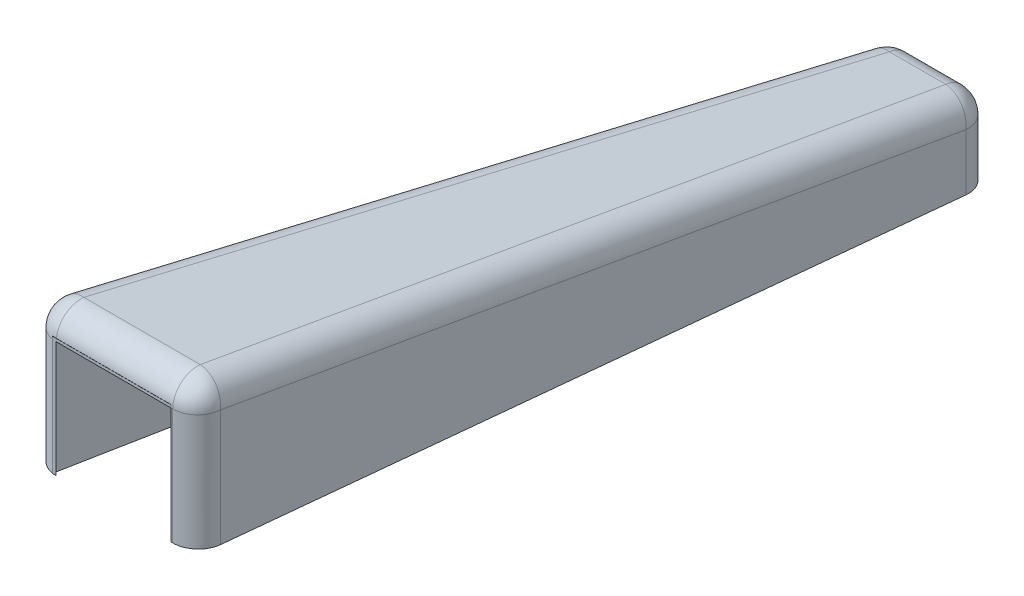
ISO-10303-21;
HEADER;
FILE_DESCRIPTION(('STEP AP214'),'2;1');
FILE_NAME('part.step','',(''),(''),'','','');
FILE_SCHEMA(('AUTOMOTIVE_DESIGN { 1 0 10303 214 1 1 1 1 }'));
ENDSEC;
DATA;
#1=APPLICATION_CONTEXT('core data for automotive mechanical design processes');
#2=APPLICATION_PROTOCOL_DEFINITION('international standard','automotive_design',2000,#1);
#3=PRODUCT_CONTEXT('',#1,'mechanical');
#4=PRODUCT('Part','Part','',(#3));
#5=PRODUCT_RELATED_PRODUCT_CATEGORY('part','',(#4));
#6=PRODUCT_DEFINITION_FORMATION('','',#4);
#7=PRODUCT_DEFINITION_CONTEXT('part definition',#1,'design');
#8=PRODUCT_DEFINITION('design','',#6,#7);
#9=PRODUCT_DEFINITION_SHAPE('','',#8);
#10=(LENGTH_UNIT() NAMED_UNIT(*) SI_UNIT(.MILLI.,.METRE.));
#11=(NAMED_UNIT(*) PLANE_ANGLE_UNIT() SI_UNIT($,.RADIAN.));
#12=(NAMED_UNIT(*) SI_UNIT($,.STERADIAN.) SOLID_ANGLE_UNIT());
#13=UNCERTAINTY_MEASURE_WITH_UNIT(LENGTH_MEASURE(1.E-05),#10,'distance_accuracy_value','');
#14=(GEOMETRIC_REPRESENTATION_CONTEXT(3) GLOBAL_UNCERTAINTY_ASSIGNED_CONTEXT((#13)) GLOBAL_UNIT_ASSIGNED_CONTEXT((#10,
#11,#12)) REPRESENTATION_CONTEXT('',''));
#15=CARTESIAN_POINT('',(0.,0.,0.));
#16=DIRECTION('',(0.,0.,1.));
#17=DIRECTION('',(1.,0.,0.));
#18=AXIS2_PLACEMENT_3D('',#15,#16,#17);
#19=CARTESIAN_POINT('',(0.,0.,300.));
#20=DIRECTION('',(0.,0.,1.));
#21=DIRECTION('',(1.,0.,0.));
#22=AXIS2_PLACEMENT_3D('',#19,#20,#21);
#23=PLANE('',#22);
#24=DIRECTION('',(-1.,0.,0.));
#25=VECTOR('',#24,1.);
#26=CARTESIAN_POINT('',(-48.093004145453,54.8807064057236,300.));
#27=LINE('',#26,#25);
#28=CARTESIAN_POINT('',(10.6163492796095,54.8807064057236,300.));
#29=VERTEX_POINT('',#28);
#30=CARTESIAN_POINT('',(9.87991580809443,54.8807064057235,300.));
#31=VERTEX_POINT('',#30);
#32=EDGE_CURVE('E283',#29,#31,#27,.T.);
#33=ORIENTED_EDGE('',*,*,#32,.T.);
#34=DIRECTION('',(0.,-1.,0.));
#35=VECTOR('',#34,1.);
#36=CARTESIAN_POINT('',(9.87991580809444,0.,300.));
#37=LINE('',#36,#35);
#38=CARTESIAN_POINT('',(9.87991580809443,8.08106382938917,300.));
#39=VERTEX_POINT('',#38);
#40=EDGE_CURVE('E12',#31,#39,#37,.T.);
#41=ORIENTED_EDGE('',*,*,#40,.T.);
#42=DIRECTION('',(1.,0.,0.));
#43=VECTOR('',#42,1.);
#44=CARTESIAN_POINT('',(-48.093004145453,8.08106382938917,300.));
#45=LINE('',#44,#43);
#46=CARTESIAN_POINT('',(10.6163492796095,8.08106382938917,300.));
#47=VERTEX_POINT('',#46);
#48=EDGE_CURVE('E61',#39,#47,#45,.T.);
#49=ORIENTED_EDGE('',*,*,#48,.T.);
#50=DIRECTION('',(0.,1.,0.));
#51=VECTOR('',#50,1.);
#52=CARTESIAN_POINT('',(10.6163492796095,66.0810638293891,300.));
#53=LINE('',#52,#51);
#54=EDGE_CURVE('E290',#47,#29,#53,.T.);
#55=ORIENTED_EDGE('',*,*,#54,.T.);
#56=EDGE_LOOP('',(#33,#41,#49,#55));
#57=FACE_BOUND('',#56,.T.);
#58=ADVANCED_FACE('F57',(#57),#23,.T.);
#59=CARTESIAN_POINT('',(0.,0.,0.));
#60=DIRECTION('',(0.,0.,-1.));
#61=DIRECTION('',(-1.,0.,0.));
#62=AXIS2_PLACEMENT_3D('',#59,#60,#61);
#63=PLANE('',#62);
#64=DIRECTION('',(0.,1.,0.));
#65=VECTOR('',#64,1.);
#66=CARTESIAN_POINT('',(31.2364864820323,0.,0.));
#67=LINE('',#66,#65);
#68=CARTESIAN_POINT('',(31.2364864820323,23.0717134982937,0.));
#69=VERTEX_POINT('',#68);
#70=CARTESIAN_POINT('',(31.2364864820323,21.935678037314,0.));
#71=VERTEX_POINT('',#70);
#72=EDGE_CURVE('E196',#69,#71,#67,.F.);
#73=ORIENTED_EDGE('',*,*,#72,.T.);
#74=DIRECTION('',(-1.,0.,0.));
#75=VECTOR('',#74,1.);
#76=CARTESIAN_POINT('',(0.,21.935678037314,0.));
#77=LINE('',#76,#75);
#78=CARTESIAN_POINT('',(10.1276813759635,21.935678037314,0.));
#79=VERTEX_POINT('',#78);
#80=EDGE_CURVE('E68',#71,#79,#77,.T.);
#81=ORIENTED_EDGE('',*,*,#80,.T.);
#82=DIRECTION('',(0.,-1.,0.));
#83=VECTOR('',#82,1.);
#84=CARTESIAN_POINT('',(10.1276813759635,0.,0.));
#85=LINE('',#84,#83);
#86=CARTESIAN_POINT('',(10.1276813759635,0.,0.));
#87=VERTEX_POINT('',#86);
#88=EDGE_CURVE('E170',#79,#87,#85,.T.);
#89=ORIENTED_EDGE('',*,*,#88,.T.);
#90=DIRECTION('',(1.,0.,0.));
#91=VECTOR('',#90,1.);
#92=CARTESIAN_POINT('',(0.,0.,0.));
#93=LINE('',#92,#91);
#94=CARTESIAN_POINT('',(8.52458123778177,0.,0.));
#95=VERTEX_POINT('',#94);
#96=EDGE_CURVE('E259',#95,#87,#93,.T.);
#97=ORIENTED_EDGE('',*,*,#96,.F.);
#98=DIRECTION('',(0.,-1.,0.));
#99=VECTOR('',#98,1.);
#100=CARTESIAN_POINT('',(8.52458123778176,32.,0.));
#101=LINE('',#100,#99);
#102=CARTESIAN_POINT('',(8.52458123778176,23.0717134982937,0.));
#103=VERTEX_POINT('',#102);
#104=EDGE_CURVE('E431',#95,#103,#101,.F.);
#105=ORIENTED_EDGE('',*,*,#104,.T.);
#106=DIRECTION('',(-1.,0.,0.));
#107=VECTOR('',#106,1.);
#108=CARTESIAN_POINT('',(42.,23.0717134982937,0.));
#109=LINE('',#108,#107);
#110=EDGE_CURVE('E394',#103,#69,#109,.F.);
#111=ORIENTED_EDGE('',*,*,#110,.T.);
#112=EDGE_LOOP('',(#73,#81,#89,#97,#105,#111));
#113=FACE_BOUND('',#112,.T.);
#114=ADVANCED_FACE('F194',(#113),#63,.T.);
#115=CARTESIAN_POINT('',(0.,0.,0.));
#116=DIRECTION('',(0.,0.999637399577244,-0.0269271121074277));
#117=DIRECTION('',(0.,0.0269271121074277,0.999637399577244));
#118=AXIS2_PLACEMENT_3D('',#115,#116,#117);
#119=PLANE('',#118);
#120=DIRECTION('',(-0.0734179717950565,0.0268544428088677,0.99693963724938));
#121=VECTOR('',#120,1.);
#122=CARTESIAN_POINT('',(31.8005795657354,0.063037768205778,2.34020307981689));
#123=LINE('',#122,#121);
#124=CARTESIAN_POINT('',(31.9719255138638,0.000363740960931889,0.0135034558052503));
#125=VERTEX_POINT('',#124);
#126=EDGE_CURVE('E619',#125,#39,#123,.T.);
#127=ORIENTED_EDGE('',*,*,#126,.F.);
#128=CARTESIAN_POINT('',(31.2364864820323,0.269368794312972,10.));
#129=DIRECTION('',(0.,0.999637399577244,-0.0269271121074277));
#130=DIRECTION('',(0.,-0.0269271121074277,-0.999637399577244));
#131=AXIS2_PLACEMENT_3D('',#128,#129,#130);
#132=ELLIPSE('',#131,10.0036273194951,10.);
#133=CARTESIAN_POINT('',(41.2094795704218,0.289152439740628,10.7344445921479));
#134=VERTEX_POINT('',#133);
#135=EDGE_CURVE('E260',#125,#134,#132,.F.);
#136=ORIENTED_EDGE('',*,*,#135,.T.);
#137=DIRECTION('',(-0.0734179717950565,0.0268544428088677,0.99693963724938));
#138=VECTOR('',#137,1.);
#139=CARTESIAN_POINT('',(42.,0.,0.));
#140=LINE('',#139,#138);
#141=CARTESIAN_POINT('',(20.589342367999,7.83147868050385,290.734444592148));
#142=VERTEX_POINT('',#141);
#143=EDGE_CURVE('E345',#134,#142,#140,.T.);
#144=ORIENTED_EDGE('',*,*,#143,.T.);
#145=CARTESIAN_POINT('',(10.6163492796095,7.81169503507619,290.));
#146=DIRECTION('',(0.,0.999637399577244,-0.0269271121074277));
#147=DIRECTION('',(0.,-0.0269271121074277,-0.999637399577244));
#148=AXIS2_PLACEMENT_3D('',#145,#146,#147);
#149=ELLIPSE('',#148,10.0036273194951,10.);
#150=EDGE_CURVE('E448',#142,#47,#149,.F.);
#151=ORIENTED_EDGE('',*,*,#150,.T.);
#152=ORIENTED_EDGE('',*,*,#48,.F.);
#153=EDGE_LOOP('',(#127,#136,#144,#151,#152));
#154=FACE_BOUND('',#153,.T.);
#155=ADVANCED_FACE('F334',(#154),#119,.F.);
#156=CARTESIAN_POINT('',(0.,0.,0.));
#157=DIRECTION('',(0.987392832453581,0.,0.158288958614602));
#158=DIRECTION('',(0.158288958614602,0.,-0.987392832453581));
#159=AXIS2_PLACEMENT_3D('',#156,#157,#158);
#160=PLANE('',#159);
#161=DIRECTION('',(-0.157302430565157,0.111472224949708,0.981238955812016));
#162=VECTOR('',#161,1.);
#163=CARTESIAN_POINT('',(0.387792016125398,21.8406914463814,-2.41901305407675));
#164=LINE('',#163,#162);
#165=CARTESIAN_POINT('',(-46.2361509558435,54.8807064057236,288.417110413854));
#166=VERTEX_POINT('',#165);
#167=CARTESIAN_POINT('',(-1.34934708675405,23.0717134982937,8.41711041385398));
#168=VERTEX_POINT('',#167);
#169=EDGE_CURVE('E272',#166,#168,#164,.F.);
#170=ORIENTED_EDGE('',*,*,#169,.T.);
#171=DIRECTION('',(0.,-1.,0.));
#172=VECTOR('',#171,1.);
#173=CARTESIAN_POINT('',(-1.34934708675404,0.,8.41711041385398));
#174=LINE('',#173,#172);
#175=CARTESIAN_POINT('',(-1.34934708675405,0.226730688377901,8.41711041385398));
#176=VERTEX_POINT('',#175);
#177=EDGE_CURVE('E279',#168,#176,#174,.T.);
#178=ORIENTED_EDGE('',*,*,#177,.T.);
#179=DIRECTION('',(-0.158233000279283,0.0265878790043007,0.987043769198038));
#180=VECTOR('',#179,1.);
#181=CARTESIAN_POINT('',(0.,0.,0.));
#182=LINE('',#181,#180);
#183=CARTESIAN_POINT('',(-46.2361509558435,7.76905692914113,288.417110413854));
#184=VERTEX_POINT('',#183);
#185=EDGE_CURVE('E355',#176,#184,#182,.T.);
#186=ORIENTED_EDGE('',*,*,#185,.T.);
#187=DIRECTION('',(0.,-1.,0.));
#188=VECTOR('',#187,1.);
#189=CARTESIAN_POINT('',(-46.2361509558435,66.0810638293892,288.417110413854));
#190=LINE('',#189,#188);
#191=EDGE_CURVE('E276',#184,#166,#190,.F.);
#192=ORIENTED_EDGE('',*,*,#191,.T.);
#193=EDGE_LOOP('',(#170,#178,#186,#192));
#194=FACE_BOUND('',#193,.T.);
#195=ADVANCED_FACE('F407',(#194),#160,.F.);
#196=CARTESIAN_POINT('',(0.,31.5922774694907,-3.58899474984495));
#197=DIRECTION('',(0.,-0.993608912460825,0.112877495890091));
#198=DIRECTION('',(0.,-0.112877495890091,-0.993608912460825));
#199=AXIS2_PLACEMENT_3D('',#196,#197,#198);
#200=PLANE('',#199);
#201=DIRECTION('',(-1.,0.,0.));
#202=VECTOR('',#201,1.);
#203=CARTESIAN_POINT('',(19.906995854547,64.8167955303318,288.871225041099));
#204=LINE('',#203,#202);
#205=CARTESIAN_POINT('',(-36.3622226313077,64.8167955303318,288.871225041099));
#206=VERTEX_POINT('',#205);
#207=CARTESIAN_POINT('',(10.6163492796095,64.8167955303318,288.871225041099));
#208=VERTEX_POINT('',#207);
#209=EDGE_CURVE('E300',#206,#208,#204,.F.);
#210=ORIENTED_EDGE('',*,*,#209,.T.);
#211=DIRECTION('',(-0.0729775770860391,0.112576517272566,0.990959535501541));
#212=VECTOR('',#211,1.);
#213=CARTESIAN_POINT('',(31.9828548294835,31.8564414443926,-1.26368023304115));
#214=LINE('',#213,#212);
#215=CARTESIAN_POINT('',(31.2364864820323,33.0078026229019,8.87122504109909));
#216=VERTEX_POINT('',#215);
#217=EDGE_CURVE('E84',#208,#216,#214,.F.);
#218=ORIENTED_EDGE('',*,*,#217,.T.);
#219=DIRECTION('',(-1.,0.,0.));
#220=VECTOR('',#219,1.);
#221=CARTESIAN_POINT('',(0.,33.0078026229019,8.87122504109909));
#222=LINE('',#221,#220);
#223=CARTESIAN_POINT('',(8.52458123778177,33.0078026229019,8.87122504109909));
#224=VERTEX_POINT('',#223);
#225=EDGE_CURVE('E200',#216,#224,#222,.T.);
#226=ORIENTED_EDGE('',*,*,#225,.T.);
#227=DIRECTION('',(-0.157302430565158,0.111472224949708,0.981238955812016));
#228=VECTOR('',#227,1.);
#229=CARTESIAN_POINT('',(10.2617203406612,31.7767805709896,-1.96489842683164));
#230=LINE('',#229,#228);
#231=EDGE_CURVE('E295',#224,#206,#230,.T.);
#232=ORIENTED_EDGE('',*,*,#231,.T.);
#233=EDGE_LOOP('',(#210,#218,#226,#232));
#234=FACE_BOUND('',#233,.T.);
#235=ADVANCED_FACE('F303',(#234),#200,.F.);
#236=ORIENTED_EDGE('',*,*,#96,.T.);
#237=DIRECTION('',(-0.158233000279283,0.0265878790043007,0.987043769198038));
#238=VECTOR('',#237,1.);
#239=CARTESIAN_POINT('',(9.87410770645281,0.0426079644051987,1.58177061726362));
#240=LINE('',#239,#238);
#241=CARTESIAN_POINT('',(-37.9451122174537,8.07766785186749,299.873928324536));
#242=VERTEX_POINT('',#241);
#243=EDGE_CURVE('E176',#87,#242,#240,.T.);
#244=ORIENTED_EDGE('',*,*,#243,.T.);
#245=CARTESIAN_POINT('',(-36.3622226313077,7.81169503507619,290.));
#246=DIRECTION('',(0.,0.999637399577244,-0.0269271121074277));
#247=DIRECTION('',(0.,0.0269271121074277,0.999637399577244));
#248=AXIS2_PLACEMENT_3D('',#245,#246,#247);
#249=ELLIPSE('',#248,10.0036273194951,10.);
#250=EDGE_CURVE('E473',#242,#184,#249,.F.);
#251=ORIENTED_EDGE('',*,*,#250,.T.);
#252=ORIENTED_EDGE('',*,*,#185,.F.);
#253=CARTESIAN_POINT('',(8.52458123778176,0.269368794312972,10.));
#254=DIRECTION('',(0.,0.999637399577244,-0.0269271121074277));
#255=DIRECTION('',(0.,0.0269271121074277,0.999637399577244));
#256=AXIS2_PLACEMENT_3D('',#253,#254,#255);
#257=ELLIPSE('',#256,10.0036273194951,10.);
#258=EDGE_CURVE('E265',#176,#95,#257,.F.);
#259=ORIENTED_EDGE('',*,*,#258,.T.);
#260=EDGE_LOOP('',(#236,#244,#251,#252,#259));
#261=FACE_BOUND('',#260,.T.);
#262=ADVANCED_FACE('F366',(#261),#119,.F.);
#263=CARTESIAN_POINT('',(41.7734482792472,0.,3.07633655334425));
#264=DIRECTION('',(-0.99729930883895,0.,-0.0734444592147877));
#265=DIRECTION('',(-0.0734444592147877,0.,0.99729930883895));
#266=AXIS2_PLACEMENT_3D('',#263,#264,#265);
#267=PLANE('',#266);
#268=ORIENTED_EDGE('',*,*,#143,.F.);
#269=DIRECTION('',(0.,1.,0.));
#270=VECTOR('',#269,1.);
#271=CARTESIAN_POINT('',(41.2094795704218,32.,10.7344445921479));
#272=LINE('',#271,#270);
#273=CARTESIAN_POINT('',(41.2094795704218,23.0717134982937,10.7344445921479));
#274=VERTEX_POINT('',#273);
#275=EDGE_CURVE('E391',#134,#274,#272,.T.);
#276=ORIENTED_EDGE('',*,*,#275,.T.);
#277=DIRECTION('',(-0.0729775770860391,0.112576517272566,0.990959535501542));
#278=VECTOR('',#277,1.);
#279=CARTESIAN_POINT('',(41.955847917873,21.9203523197844,0.599539318007641));
#280=LINE('',#279,#278);
#281=CARTESIAN_POINT('',(20.589342367999,54.8807064057236,290.734444592148));
#282=VERTEX_POINT('',#281);
#283=EDGE_CURVE('E314',#274,#282,#280,.T.);
#284=ORIENTED_EDGE('',*,*,#283,.T.);
#285=DIRECTION('',(0.,1.,0.));
#286=VECTOR('',#285,1.);
#287=CARTESIAN_POINT('',(20.589342367999,8.08106382938916,290.734444592148));
#288=LINE('',#287,#286);
#289=EDGE_CURVE('E435',#282,#142,#288,.F.);
#290=ORIENTED_EDGE('',*,*,#289,.T.);
#291=EDGE_LOOP('',(#268,#276,#284,#290));
#292=FACE_BOUND('',#291,.T.);
#293=ADVANCED_FACE('F338',(#292),#267,.F.);
#294=CARTESIAN_POINT('',(-36.3622226313077,0.,290.));
#295=DIRECTION('',(0.,1.,0.));
#296=DIRECTION('',(-1.,0.,0.));
#297=AXIS2_PLACEMENT_3D('',#294,#295,#296);
#298=CYLINDRICAL_SURFACE('',#297,10.);
#299=CARTESIAN_POINT('',(-36.3622226313077,54.8807064057236,290.));
#300=DIRECTION('',(0.,1.,0.));
#301=DIRECTION('',(0.,0.,1.));
#302=AXIS2_PLACEMENT_3D('',#299,#300,#301);
#303=CIRCLE('',#302,10.);
#304=CARTESIAN_POINT('',(-36.3622226313077,54.8807064057236,300.));
#305=VERTEX_POINT('',#304);
#306=EDGE_CURVE('E255',#166,#305,#303,.T.);
#307=ORIENTED_EDGE('',*,*,#306,.F.);
#308=ORIENTED_EDGE('',*,*,#191,.F.);
#309=ORIENTED_EDGE('',*,*,#250,.F.);
#310=CARTESIAN_POINT('',(-36.3622226313077,8.08106382938917,300.));
#311=VERTEX_POINT('',#310);
#312=EDGE_CURVE('E451',#311,#242,#249,.F.);
#313=ORIENTED_EDGE('',*,*,#312,.F.);
#314=DIRECTION('',(0.,-1.,0.));
#315=VECTOR('',#314,1.);
#316=CARTESIAN_POINT('',(-36.3622226313077,8.08106382938917,300.));
#317=LINE('',#316,#315);
#318=EDGE_CURVE('E287',#305,#311,#317,.T.);
#319=ORIENTED_EDGE('',*,*,#318,.F.);
#320=EDGE_LOOP('',(#307,#308,#309,#313,#319));
#321=FACE_BOUND('',#320,.T.);
#322=ADVANCED_FACE('F59',(#321),#298,.T.);
#323=CARTESIAN_POINT('',(-36.3622226313077,54.8807064057236,290.));
#324=DIRECTION('',(0.,0.,1.));
#325=DIRECTION('',(1.,0.,0.));
#326=AXIS2_PLACEMENT_3D('',#323,#324,#325);
#327=SPHERICAL_SURFACE('',#326,10.);
#328=CARTESIAN_POINT('',(-36.3622226313077,54.8807064057236,290.));
#329=DIRECTION('',(-0.157302430565155,0.111472224949708,0.981238955812017));
#330=DIRECTION('',(0.987392832453581,0.,0.158288958614599));
#331=AXIS2_PLACEMENT_3D('',#328,#329,#330);
#332=CIRCLE('',#331,10.);
#333=EDGE_CURVE('E247',#166,#206,#332,.F.);
#334=ORIENTED_EDGE('',*,*,#333,.F.);
#335=ORIENTED_EDGE('',*,*,#306,.T.);
#336=CARTESIAN_POINT('',(-36.3622226313077,54.8807064057236,290.));
#337=DIRECTION('',(-1.,0.,0.));
#338=DIRECTION('',(0.,-1.,0.));
#339=AXIS2_PLACEMENT_3D('',#336,#337,#338);
#340=CIRCLE('',#339,10.);
#341=EDGE_CURVE('E251',#206,#305,#340,.F.);
#342=ORIENTED_EDGE('',*,*,#341,.F.);
#343=EDGE_LOOP('',(#334,#335,#342));
#344=FACE_BOUND('',#343,.T.);
#345=ADVANCED_FACE('F501',(#344),#327,.T.);
#346=CARTESIAN_POINT('',(10.6163492796095,0.,290.));
#347=DIRECTION('',(0.,-1.,0.));
#348=DIRECTION('',(1.,0.,0.));
#349=AXIS2_PLACEMENT_3D('',#346,#347,#348);
#350=CYLINDRICAL_SURFACE('',#349,10.);
#351=ORIENTED_EDGE('',*,*,#150,.F.);
#352=ORIENTED_EDGE('',*,*,#289,.F.);
#353=CARTESIAN_POINT('',(10.6163492796095,54.8807064057236,290.));
#354=DIRECTION('',(0.,1.,0.));
#355=DIRECTION('',(0.,0.,1.));
#356=AXIS2_PLACEMENT_3D('',#353,#354,#355);
#357=CIRCLE('',#356,10.);
#358=EDGE_CURVE('E243',#29,#282,#357,.T.);
#359=ORIENTED_EDGE('',*,*,#358,.F.);
#360=ORIENTED_EDGE('',*,*,#54,.F.);
#361=EDGE_LOOP('',(#351,#352,#359,#360));
#362=FACE_BOUND('',#361,.T.);
#363=ADVANCED_FACE('F454',(#362),#350,.T.);
#364=CARTESIAN_POINT('',(0.,54.8807064057236,290.));
#365=DIRECTION('',(1.,0.,0.));
#366=DIRECTION('',(0.,0.,-1.));
#367=AXIS2_PLACEMENT_3D('',#364,#365,#366);
#368=CYLINDRICAL_SURFACE('',#367,10.);
#369=ORIENTED_EDGE('',*,*,#341,.T.);
#370=EDGE_CURVE('E282',#31,#305,#27,.T.);
#371=ORIENTED_EDGE('',*,*,#370,.F.);
#372=ORIENTED_EDGE('',*,*,#32,.F.);
#373=CARTESIAN_POINT('',(10.6163492796095,54.8807064057236,290.));
#374=DIRECTION('',(1.,0.,0.));
#375=DIRECTION('',(0.,0.,-1.));
#376=AXIS2_PLACEMENT_3D('',#373,#374,#375);
#377=CIRCLE('',#376,10.);
#378=EDGE_CURVE('E239',#208,#29,#377,.T.);
#379=ORIENTED_EDGE('',*,*,#378,.F.);
#380=ORIENTED_EDGE('',*,*,#209,.F.);
#381=EDGE_LOOP('',(#369,#371,#372,#379,#380));
#382=FACE_BOUND('',#381,.T.);
#383=ADVANCED_FACE('F461',(#382),#368,.T.);
#384=CARTESIAN_POINT('',(10.2617203406612,21.8406914463814,-0.836123467930731));
#385=DIRECTION('',(-0.157302430565157,0.111472224949708,0.981238955812016));
#386=DIRECTION('',(0.987392832453581,0.,0.158288958614602));
#387=AXIS2_PLACEMENT_3D('',#384,#385,#386);
#388=CYLINDRICAL_SURFACE('',#387,10.);
#389=ORIENTED_EDGE('',*,*,#333,.T.);
#390=ORIENTED_EDGE('',*,*,#231,.F.);
#391=CARTESIAN_POINT('',(8.52458123778176,23.0717134982937,10.));
#392=DIRECTION('',(0.157302430565158,-0.111472224949708,-0.981238955812016));
#393=DIRECTION('',(-0.987392832453581,0.,-0.158288958614602));
#394=AXIS2_PLACEMENT_3D('',#391,#392,#393);
#395=CIRCLE('',#394,10.);
#396=EDGE_CURVE('E235',#168,#224,#395,.T.);
#397=ORIENTED_EDGE('',*,*,#396,.F.);
#398=ORIENTED_EDGE('',*,*,#169,.F.);
#399=EDGE_LOOP('',(#389,#390,#397,#398));
#400=FACE_BOUND('',#399,.T.);
#401=ADVANCED_FACE('F427',(#400),#388,.T.);
#402=CARTESIAN_POINT('',(8.52458123778176,0.,10.));
#403=DIRECTION('',(0.,1.,0.));
#404=DIRECTION('',(-1.,0.,0.));
#405=AXIS2_PLACEMENT_3D('',#402,#403,#404);
#406=CYLINDRICAL_SURFACE('',#405,10.);
#407=ORIENTED_EDGE('',*,*,#258,.F.);
#408=ORIENTED_EDGE('',*,*,#177,.F.);
#409=CARTESIAN_POINT('',(8.52458123778176,23.0717134982937,10.));
#410=DIRECTION('',(0.,1.,0.));
#411=DIRECTION('',(-1.,0.,0.));
#412=AXIS2_PLACEMENT_3D('',#409,#410,#411);
#413=CIRCLE('',#412,10.);
#414=EDGE_CURVE('E231',#103,#168,#413,.T.);
#415=ORIENTED_EDGE('',*,*,#414,.F.);
#416=ORIENTED_EDGE('',*,*,#104,.F.);
#417=EDGE_LOOP('',(#407,#408,#415,#416));
#418=FACE_BOUND('',#417,.T.);
#419=ADVANCED_FACE('F426',(#418),#406,.T.);
#420=CARTESIAN_POINT('',(10.6163492796095,54.8807064057236,290.));
#421=DIRECTION('',(0.99729930883895,0.,0.0734444592147887));
#422=DIRECTION('',(0.0734444592147887,0.,-0.99729930883895));
#423=AXIS2_PLACEMENT_3D('',#420,#421,#422);
#424=SPHERICAL_SURFACE('',#423,10.);
#425=ORIENTED_EDGE('',*,*,#378,.T.);
#426=ORIENTED_EDGE('',*,*,#358,.T.);
#427=CARTESIAN_POINT('',(10.6163492796095,54.8807064057236,290.));
#428=DIRECTION('',(-0.07297757708604,0.112576517272565,0.990959535501542));
#429=DIRECTION('',(0.,-0.993608912460825,0.11287749589009));
#430=AXIS2_PLACEMENT_3D('',#427,#428,#429);
#431=CIRCLE('',#430,10.);
#432=EDGE_CURVE('E227',#208,#282,#431,.F.);
#433=ORIENTED_EDGE('',*,*,#432,.F.);
#434=EDGE_LOOP('',(#425,#426,#433));
#435=FACE_BOUND('',#434,.T.);
#436=ADVANCED_FACE('F458',(#435),#424,.T.);
#437=CARTESIAN_POINT('',(8.52458123778176,23.0717134982937,10.));
#438=DIRECTION('',(0.,0.,-1.));
#439=DIRECTION('',(-1.,0.,0.));
#440=AXIS2_PLACEMENT_3D('',#437,#438,#439);
#441=SPHERICAL_SURFACE('',#440,10.);
#442=ORIENTED_EDGE('',*,*,#414,.T.);
#443=ORIENTED_EDGE('',*,*,#396,.T.);
#444=CARTESIAN_POINT('',(8.52458123778177,23.0717134982937,10.));
#445=DIRECTION('',(-1.,0.,0.));
#446=DIRECTION('',(0.,0.,1.));
#447=AXIS2_PLACEMENT_3D('',#444,#445,#446);
#448=CIRCLE('',#447,10.);
#449=EDGE_CURVE('E224',#103,#224,#448,.F.);
#450=ORIENTED_EDGE('',*,*,#449,.F.);
#451=EDGE_LOOP('',(#442,#443,#450));
#452=FACE_BOUND('',#451,.T.);
#453=ADVANCED_FACE('F429',(#452),#441,.T.);
#454=CARTESIAN_POINT('',(31.9828548294835,21.9203523197844,-0.134905274140237));
#455=DIRECTION('',(-0.0729775770860391,0.112576517272566,0.990959535501542));
#456=DIRECTION('',(0.,-0.993608912460825,0.112877495890091));
#457=AXIS2_PLACEMENT_3D('',#454,#455,#456);
#458=CYLINDRICAL_SURFACE('',#457,10.);
#459=ORIENTED_EDGE('',*,*,#432,.T.);
#460=ORIENTED_EDGE('',*,*,#283,.F.);
#461=CARTESIAN_POINT('',(31.2364864820323,23.0717134982937,10.));
#462=DIRECTION('',(0.0729775770860388,-0.112576517272566,-0.990959535501541));
#463=DIRECTION('',(0.,0.993608912460824,-0.112877495890091));
#464=AXIS2_PLACEMENT_3D('',#461,#462,#463);
#465=CIRCLE('',#464,10.);
#466=EDGE_CURVE('E218',#216,#274,#465,.T.);
#467=ORIENTED_EDGE('',*,*,#466,.F.);
#468=ORIENTED_EDGE('',*,*,#217,.F.);
#469=EDGE_LOOP('',(#459,#460,#467,#468));
#470=FACE_BOUND('',#469,.T.);
#471=ADVANCED_FACE('F313',(#470),#458,.T.);
#472=CARTESIAN_POINT('',(0.,23.0717134982937,10.));
#473=DIRECTION('',(1.,0.,0.));
#474=DIRECTION('',(0.,0.,-1.));
#475=AXIS2_PLACEMENT_3D('',#472,#473,#474);
#476=CYLINDRICAL_SURFACE('',#475,10.);
#477=ORIENTED_EDGE('',*,*,#449,.T.);
#478=ORIENTED_EDGE('',*,*,#225,.F.);
#479=CARTESIAN_POINT('',(31.2364864820323,23.0717134982937,10.));
#480=DIRECTION('',(1.,0.,0.));
#481=DIRECTION('',(0.,1.,0.));
#482=AXIS2_PLACEMENT_3D('',#479,#480,#481);
#483=CIRCLE('',#482,10.);
#484=EDGE_CURVE('E210',#69,#216,#483,.T.);
#485=ORIENTED_EDGE('',*,*,#484,.F.);
#486=ORIENTED_EDGE('',*,*,#110,.F.);
#487=EDGE_LOOP('',(#477,#478,#485,#486));
#488=FACE_BOUND('',#487,.T.);
#489=ADVANCED_FACE('F308',(#488),#476,.T.);
#490=CARTESIAN_POINT('',(31.2364864820323,23.0717134982937,10.));
#491=DIRECTION('',(0.99729930883895,0.,0.0734444592147877));
#492=DIRECTION('',(0.0734444592147877,0.,-0.99729930883895));
#493=AXIS2_PLACEMENT_3D('',#490,#491,#492);
#494=SPHERICAL_SURFACE('',#493,10.);
#495=ORIENTED_EDGE('',*,*,#484,.T.);
#496=ORIENTED_EDGE('',*,*,#466,.T.);
#497=CARTESIAN_POINT('',(31.2364864820323,23.0717134982937,10.));
#498=DIRECTION('',(0.,1.,0.));
#499=DIRECTION('',(0.,0.,1.));
#500=AXIS2_PLACEMENT_3D('',#497,#498,#499);
#501=CIRCLE('',#500,10.);
#502=EDGE_CURVE('E205',#69,#274,#501,.F.);
#503=ORIENTED_EDGE('',*,*,#502,.F.);
#504=EDGE_LOOP('',(#495,#496,#503));
#505=FACE_BOUND('',#504,.T.);
#506=ADVANCED_FACE('F317',(#505),#494,.T.);
#507=CARTESIAN_POINT('',(31.2364864820323,0.,10.));
#508=DIRECTION('',(0.,-1.,0.));
#509=DIRECTION('',(1.,0.,0.));
#510=AXIS2_PLACEMENT_3D('',#507,#508,#509);
#511=CYLINDRICAL_SURFACE('',#510,10.);
#512=CARTESIAN_POINT('',(31.2364864820323,0.,0.));
#513=VERTEX_POINT('',#512);
#514=EDGE_CURVE('E264',#513,#125,#132,.F.);
#515=ORIENTED_EDGE('',*,*,#514,.F.);
#516=EDGE_CURVE('E434',#71,#513,#67,.F.);
#517=ORIENTED_EDGE('',*,*,#516,.F.);
#518=ORIENTED_EDGE('',*,*,#72,.F.);
#519=ORIENTED_EDGE('',*,*,#502,.T.);
#520=ORIENTED_EDGE('',*,*,#275,.F.);
#521=ORIENTED_EDGE('',*,*,#135,.F.);
#522=EDGE_LOOP('',(#515,#517,#518,#519,#520,#521));
#523=FACE_BOUND('',#522,.T.);
#524=ADVANCED_FACE('F319',(#523),#511,.T.);
#525=CARTESIAN_POINT('',(0.,0.,0.));
#526=DIRECTION('',(0.,0.999637399577244,-0.0269271121074277));
#527=DIRECTION('',(0.,0.0269271121074277,0.999637399577244));
#528=AXIS2_PLACEMENT_3D('',#525,#526,#527);
#529=PLANE('',#528);
#530=ORIENTED_EDGE('',*,*,#514,.T.);
#531=CARTESIAN_POINT('',(31.2364864820323,0.,0.));
#532=DIRECTION('',(1.,0.,0.));
#533=VECTOR('',#532,1.);
#534=LINE('',#531,#533);
#535=EDGE_CURVE('E650',#513,#125,#534,.T.);
#536=ORIENTED_EDGE('',*,*,#535,.F.);
#537=EDGE_LOOP('',(#530,#536));
#538=FACE_BOUND('',#537,.T.);
#539=ADVANCED_FACE('F326',(#538),#529,.T.);
#540=ORIENTED_EDGE('',*,*,#312,.T.);
#541=CARTESIAN_POINT('',(-37.9653227694895,8.08106382938917,300.));
#542=VERTEX_POINT('',#541);
#543=EDGE_CURVE('E76',#242,#542,#240,.T.);
#544=ORIENTED_EDGE('',*,*,#543,.T.);
#545=CARTESIAN_POINT('',(-37.9653227694895,8.08106382938917,300.));
#546=DIRECTION('',(1.,0.,0.));
#547=VECTOR('',#546,1.);
#548=LINE('',#545,#547);
#549=EDGE_CURVE('E625',#542,#311,#548,.T.);
#550=ORIENTED_EDGE('',*,*,#549,.T.);
#551=EDGE_LOOP('',(#540,#544,#550));
#552=FACE_BOUND('',#551,.T.);
#553=ADVANCED_FACE('F566',(#552),#529,.T.);
#554=CARTESIAN_POINT('',(0.,0.,300.));
#555=DIRECTION('',(0.,0.,1.));
#556=DIRECTION('',(1.,0.,0.));
#557=AXIS2_PLACEMENT_3D('',#554,#555,#556);
#558=PLANE('',#557);
#559=ORIENTED_EDGE('',*,*,#370,.T.);
#560=ORIENTED_EDGE('',*,*,#318,.T.);
#561=ORIENTED_EDGE('',*,*,#549,.F.);
#562=DIRECTION('',(0.,1.,0.));
#563=VECTOR('',#562,1.);
#564=CARTESIAN_POINT('',(-37.9653227694895,0.,300.));
#565=LINE('',#564,#563);
#566=CARTESIAN_POINT('',(-37.9653227694895,56.0167418667032,300.));
#567=VERTEX_POINT('',#566);
#568=EDGE_CURVE('E183',#542,#567,#565,.T.);
#569=ORIENTED_EDGE('',*,*,#568,.T.);
#570=DIRECTION('',(-1.,0.,0.));
#571=VECTOR('',#570,1.);
#572=CARTESIAN_POINT('',(0.,56.0167418667032,300.));
#573=LINE('',#572,#571);
#574=CARTESIAN_POINT('',(9.87991580809443,56.0167418667032,300.));
#575=VERTEX_POINT('',#574);
#576=EDGE_CURVE('E182',#575,#567,#573,.T.);
#577=ORIENTED_EDGE('',*,*,#576,.F.);
#578=EDGE_CURVE('E638',#575,#31,#37,.T.);
#579=ORIENTED_EDGE('',*,*,#578,.T.);
#580=EDGE_LOOP('',(#559,#560,#561,#569,#577,#579));
#581=FACE_BOUND('',#580,.T.);
#582=ADVANCED_FACE('F577',(#581),#558,.F.);
#583=CARTESIAN_POINT('',(0.,0.,0.));
#584=DIRECTION('',(0.,0.,-1.));
#585=DIRECTION('',(-1.,0.,0.));
#586=AXIS2_PLACEMENT_3D('',#583,#584,#585);
#587=PLANE('',#586);
#588=ORIENTED_EDGE('',*,*,#516,.T.);
#589=ORIENTED_EDGE('',*,*,#535,.T.);
#590=DIRECTION('',(0.,-1.,0.));
#591=VECTOR('',#590,1.);
#592=CARTESIAN_POINT('',(31.9729199535474,0.,0.));
#593=LINE('',#592,#591);
#594=CARTESIAN_POINT('',(31.9729199535474,21.935678037314,0.));
#595=VERTEX_POINT('',#594);
#596=EDGE_CURVE('E622',#595,#125,#593,.T.);
#597=ORIENTED_EDGE('',*,*,#596,.F.);
#598=EDGE_CURVE('E191',#595,#71,#77,.T.);
#599=ORIENTED_EDGE('',*,*,#598,.T.);
#600=EDGE_LOOP('',(#588,#589,#597,#599));
#601=FACE_BOUND('',#600,.T.);
#602=ADVANCED_FACE('F586',(#601),#587,.F.);
#603=CARTESIAN_POINT('',(9.87392832453581,0.,1.58288958614602));
#604=DIRECTION('',(0.987392832453581,0.,0.158288958614602));
#605=DIRECTION('',(0.158288958614602,0.,-0.987392832453581));
#606=AXIS2_PLACEMENT_3D('',#603,#604,#605);
#607=PLANE('',#606);
#608=DIRECTION('',(-0.157302430565157,0.111472224949708,0.981238955812016));
#609=VECTOR('',#608,1.);
#610=CARTESIAN_POINT('',(10.2617203406612,21.8406914463814,-0.836123467930731));
#611=LINE('',#610,#609);
#612=EDGE_CURVE('E173',#79,#567,#611,.T.);
#613=ORIENTED_EDGE('',*,*,#612,.T.);
#614=ORIENTED_EDGE('',*,*,#568,.F.);
#615=ORIENTED_EDGE('',*,*,#543,.F.);
#616=ORIENTED_EDGE('',*,*,#243,.F.);
#617=ORIENTED_EDGE('',*,*,#88,.F.);
#618=EDGE_LOOP('',(#613,#614,#615,#616,#617));
#619=FACE_BOUND('',#618,.T.);
#620=ADVANCED_FACE('F172',(#619),#607,.T.);
#621=CARTESIAN_POINT('',(0.,21.6561883448824,-2.46021979094404));
#622=DIRECTION('',(0.,-0.993608912460825,0.112877495890091));
#623=DIRECTION('',(0.,-0.112877495890091,-0.993608912460825));
#624=AXIS2_PLACEMENT_3D('',#621,#622,#623);
#625=PLANE('',#624);
#626=ORIENTED_EDGE('',*,*,#576,.T.);
#627=ORIENTED_EDGE('',*,*,#612,.F.);
#628=ORIENTED_EDGE('',*,*,#80,.F.);
#629=ORIENTED_EDGE('',*,*,#598,.F.);
#630=DIRECTION('',(-0.0729775770860391,0.112576517272566,0.990959535501542));
#631=VECTOR('',#630,1.);
#632=CARTESIAN_POINT('',(31.9828548294835,21.9203523197844,-0.134905274140237));
#633=LINE('',#632,#631);
#634=EDGE_CURVE('E630',#595,#575,#633,.T.);
#635=ORIENTED_EDGE('',*,*,#634,.T.);
#636=EDGE_LOOP('',(#626,#627,#628,#629,#635));
#637=FACE_BOUND('',#636,.T.);
#638=ADVANCED_FACE('F186',(#637),#625,.T.);
#639=CARTESIAN_POINT('',(31.8004551908577,0.,2.34189196119637));
#640=DIRECTION('',(-0.99729930883895,0.,-0.0734444592147877));
#641=DIRECTION('',(-0.0734444592147877,0.,0.99729930883895));
#642=AXIS2_PLACEMENT_3D('',#639,#640,#641);
#643=PLANE('',#642);
#644=ORIENTED_EDGE('',*,*,#126,.T.);
#645=ORIENTED_EDGE('',*,*,#40,.F.);
#646=ORIENTED_EDGE('',*,*,#578,.F.);
#647=ORIENTED_EDGE('',*,*,#634,.F.);
#648=ORIENTED_EDGE('',*,*,#596,.T.);
#649=EDGE_LOOP('',(#644,#645,#646,#647,#648));
#650=FACE_BOUND('',#649,.T.);
#651=ADVANCED_FACE('F405',(#650),#643,.T.);
#652=CLOSED_SHELL('',(#58,#114,#155,#195,#235,#262,#293,#322,#345,#363,#383,#401,#419,#436,#453,
#471,#489,#506,#524,#539,#553,#582,#602,#620,#638,#651));
#653=MANIFOLD_SOLID_BREP('B2',#652);
#654=ADVANCED_BREP_SHAPE_REPRESENTATION('',(#18,#653),#14);
#655=SHAPE_DEFINITION_REPRESENTATION(#9,#654);
ENDSEC;
END-ISO-10303-21;
